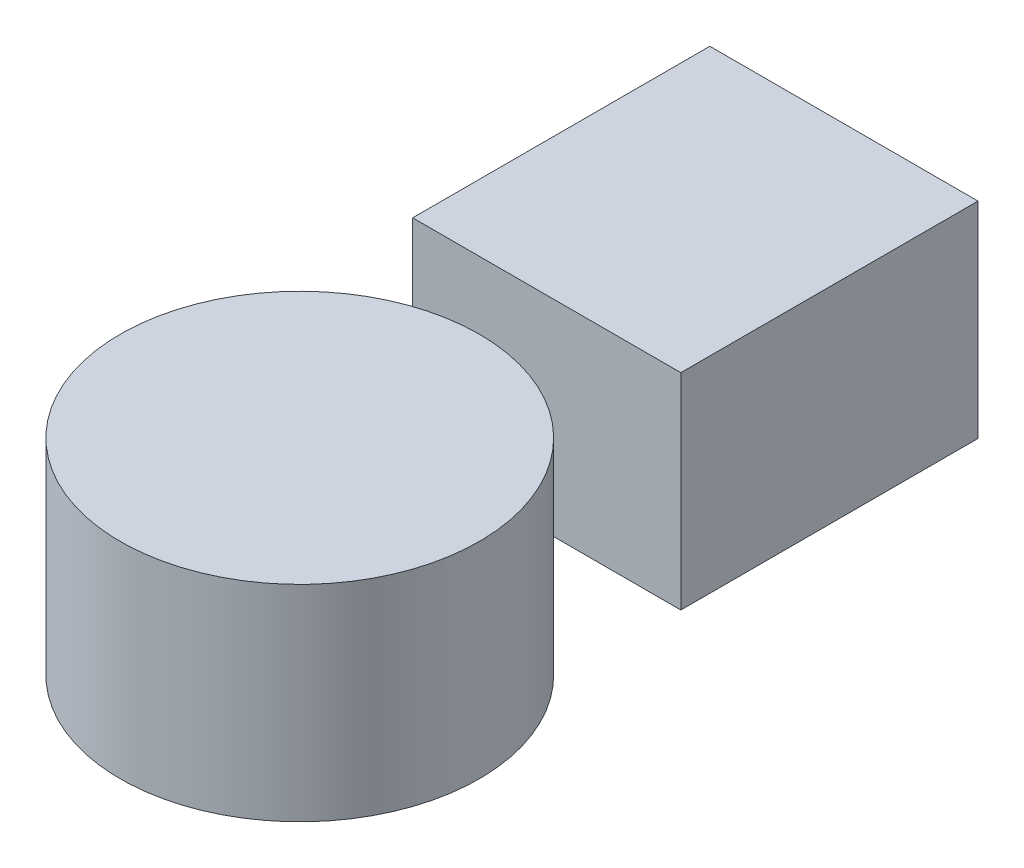
ISO-10303-21;
HEADER;
FILE_DESCRIPTION(('STEP AP214'),'2;1');
FILE_NAME('part.step','',(''),(''),'','','');
FILE_SCHEMA(('AUTOMOTIVE_DESIGN { 1 0 10303 214 1 1 1 1 }'));
ENDSEC;
DATA;
#1=APPLICATION_CONTEXT('core data for automotive mechanical design processes');
#2=APPLICATION_PROTOCOL_DEFINITION('international standard','automotive_design',2000,#1);
#3=PRODUCT_CONTEXT('',#1,'mechanical');
#4=PRODUCT('Part','Part','',(#3));
#5=PRODUCT_RELATED_PRODUCT_CATEGORY('part','',(#4));
#6=PRODUCT_DEFINITION_FORMATION('','',#4);
#7=PRODUCT_DEFINITION_CONTEXT('part definition',#1,'design');
#8=PRODUCT_DEFINITION('design','',#6,#7);
#9=PRODUCT_DEFINITION_SHAPE('','',#8);
#10=(LENGTH_UNIT() NAMED_UNIT(*) SI_UNIT(.MILLI.,.METRE.));
#11=(NAMED_UNIT(*) PLANE_ANGLE_UNIT() SI_UNIT($,.RADIAN.));
#12=(NAMED_UNIT(*) SI_UNIT($,.STERADIAN.) SOLID_ANGLE_UNIT());
#13=UNCERTAINTY_MEASURE_WITH_UNIT(LENGTH_MEASURE(1.E-05),#10,'distance_accuracy_value','');
#14=(GEOMETRIC_REPRESENTATION_CONTEXT(3) GLOBAL_UNCERTAINTY_ASSIGNED_CONTEXT((#13)) GLOBAL_UNIT_ASSIGNED_CONTEXT((#10,
#11,#12)) REPRESENTATION_CONTEXT('',''));
#15=CARTESIAN_POINT('',(0.,0.,0.));
#16=DIRECTION('',(0.,0.,1.));
#17=DIRECTION('',(1.,0.,0.));
#18=AXIS2_PLACEMENT_3D('',#15,#16,#17);
#19=CARTESIAN_POINT('',(-43.830339722009,198.053018744922,-177.866757769681));
#20=DIRECTION('',(1.,0.,0.));
#21=DIRECTION('',(0.,0.,-1.));
#22=AXIS2_PLACEMENT_3D('',#19,#20,#21);
#23=PLANE('',#22);
#24=DIRECTION('',(0.,0.,1.));
#25=VECTOR('',#24,1.);
#26=CARTESIAN_POINT('',(-43.830339722009,67.2092550326107,-177.866757769681));
#27=LINE('',#26,#25);
#28=CARTESIAN_POINT('',(-43.830339722009,67.2092550326107,-177.866757769681));
#29=VERTEX_POINT('',#28);
#30=CARTESIAN_POINT('',(-43.830339722009,67.2092550326107,-80.7292481154995));
#31=VERTEX_POINT('',#30);
#32=EDGE_CURVE('E94',#29,#31,#27,.T.);
#33=ORIENTED_EDGE('',*,*,#32,.F.);
#34=DIRECTION('',(0.,-1.,0.));
#35=VECTOR('',#34,1.);
#36=CARTESIAN_POINT('',(-43.830339722009,198.053018744922,-177.866757769681));
#37=LINE('',#36,#35);
#38=CARTESIAN_POINT('',(-43.830339722009,0.,-177.866757769681));
#39=VERTEX_POINT('',#38);
#40=EDGE_CURVE('E48',#29,#39,#37,.T.);
#41=ORIENTED_EDGE('',*,*,#40,.T.);
#42=DIRECTION('',(0.,0.,1.));
#43=VECTOR('',#42,1.);
#44=CARTESIAN_POINT('',(-43.830339722009,0.,-177.866757769681));
#45=LINE('',#44,#43);
#46=CARTESIAN_POINT('',(-43.830339722009,0.,-80.7292481154995));
#47=VERTEX_POINT('',#46);
#48=EDGE_CURVE('E92',#39,#47,#45,.T.);
#49=ORIENTED_EDGE('',*,*,#48,.T.);
#50=DIRECTION('',(0.,-1.,0.));
#51=VECTOR('',#50,1.);
#52=CARTESIAN_POINT('',(-43.830339722009,198.053018744922,-80.7292481154995));
#53=LINE('',#52,#51);
#54=EDGE_CURVE('E83',#31,#47,#53,.T.);
#55=ORIENTED_EDGE('',*,*,#54,.F.);
#56=EDGE_LOOP('',(#33,#41,#49,#55));
#57=FACE_BOUND('',#56,.T.);
#58=ADVANCED_FACE('F44',(#57),#23,.F.);
#59=CARTESIAN_POINT('',(-43.830339722009,198.053018744922,-80.7292481154995));
#60=DIRECTION('',(0.,0.,-1.));
#61=DIRECTION('',(-1.,0.,0.));
#62=AXIS2_PLACEMENT_3D('',#59,#60,#61);
#63=PLANE('',#62);
#64=DIRECTION('',(1.,0.,0.));
#65=VECTOR('',#64,1.);
#66=CARTESIAN_POINT('',(-43.830339722009,67.2092550326107,-80.7292481154995));
#67=LINE('',#66,#65);
#68=CARTESIAN_POINT('',(43.830339722009,67.2092550326107,-80.7292481154995));
#69=VERTEX_POINT('',#68);
#70=EDGE_CURVE('E53',#31,#69,#67,.T.);
#71=ORIENTED_EDGE('',*,*,#70,.F.);
#72=ORIENTED_EDGE('',*,*,#54,.T.);
#73=DIRECTION('',(1.,0.,0.));
#74=VECTOR('',#73,1.);
#75=CARTESIAN_POINT('',(-43.830339722009,0.,-80.7292481154995));
#76=LINE('',#75,#74);
#77=CARTESIAN_POINT('',(43.830339722009,0.,-80.7292481154995));
#78=VERTEX_POINT('',#77);
#79=EDGE_CURVE('E104',#47,#78,#76,.T.);
#80=ORIENTED_EDGE('',*,*,#79,.T.);
#81=DIRECTION('',(0.,-1.,0.));
#82=VECTOR('',#81,1.);
#83=CARTESIAN_POINT('',(43.830339722009,198.053018744922,-80.7292481154995));
#84=LINE('',#83,#82);
#85=EDGE_CURVE('E113',#69,#78,#84,.T.);
#86=ORIENTED_EDGE('',*,*,#85,.F.);
#87=EDGE_LOOP('',(#71,#72,#80,#86));
#88=FACE_BOUND('',#87,.T.);
#89=ADVANCED_FACE('F117',(#88),#63,.F.);
#90=CARTESIAN_POINT('',(43.830339722009,198.053018744922,-177.866757769681));
#91=DIRECTION('',(-1.,0.,0.));
#92=DIRECTION('',(0.,0.,1.));
#93=AXIS2_PLACEMENT_3D('',#90,#91,#92);
#94=PLANE('',#93);
#95=DIRECTION('',(0.,0.,-1.));
#96=VECTOR('',#95,1.);
#97=CARTESIAN_POINT('',(43.830339722009,67.2092550326107,-177.866757769681));
#98=LINE('',#97,#96);
#99=CARTESIAN_POINT('',(43.830339722009,67.2092550326107,-177.866757769681));
#100=VERTEX_POINT('',#99);
#101=EDGE_CURVE('E12',#69,#100,#98,.T.);
#102=ORIENTED_EDGE('',*,*,#101,.F.);
#103=ORIENTED_EDGE('',*,*,#85,.T.);
#104=DIRECTION('',(0.,0.,-1.));
#105=VECTOR('',#104,1.);
#106=CARTESIAN_POINT('',(43.830339722009,0.,-177.866757769681));
#107=LINE('',#106,#105);
#108=CARTESIAN_POINT('',(43.830339722009,0.,-177.866757769681));
#109=VERTEX_POINT('',#108);
#110=EDGE_CURVE('E114',#78,#109,#107,.T.);
#111=ORIENTED_EDGE('',*,*,#110,.T.);
#112=DIRECTION('',(0.,-1.,0.));
#113=VECTOR('',#112,1.);
#114=CARTESIAN_POINT('',(43.830339722009,198.053018744922,-177.866757769681));
#115=LINE('',#114,#113);
#116=EDGE_CURVE('E66',#100,#109,#115,.T.);
#117=ORIENTED_EDGE('',*,*,#116,.F.);
#118=EDGE_LOOP('',(#102,#103,#111,#117));
#119=FACE_BOUND('',#118,.T.);
#120=ADVANCED_FACE('F116',(#119),#94,.F.);
#121=CARTESIAN_POINT('',(-43.830339722009,198.053018744922,-177.866757769681));
#122=DIRECTION('',(0.,0.,1.));
#123=DIRECTION('',(1.,0.,0.));
#124=AXIS2_PLACEMENT_3D('',#121,#122,#123);
#125=PLANE('',#124);
#126=DIRECTION('',(-1.,0.,0.));
#127=VECTOR('',#126,1.);
#128=CARTESIAN_POINT('',(-43.830339722009,67.2092550326107,-177.866757769681));
#129=LINE('',#128,#127);
#130=EDGE_CURVE('E101',#100,#29,#129,.T.);
#131=ORIENTED_EDGE('',*,*,#130,.F.);
#132=ORIENTED_EDGE('',*,*,#116,.T.);
#133=DIRECTION('',(-1.,0.,0.));
#134=VECTOR('',#133,1.);
#135=CARTESIAN_POINT('',(-43.830339722009,0.,-177.866757769681));
#136=LINE('',#135,#134);
#137=EDGE_CURVE('E97',#109,#39,#136,.T.);
#138=ORIENTED_EDGE('',*,*,#137,.T.);
#139=ORIENTED_EDGE('',*,*,#40,.F.);
#140=EDGE_LOOP('',(#131,#132,#138,#139));
#141=FACE_BOUND('',#140,.T.);
#142=ADVANCED_FACE('F98',(#141),#125,.F.);
#143=CARTESIAN_POINT('',(0.,0.,0.));
#144=DIRECTION('',(0.,1.,0.));
#145=DIRECTION('',(0.,0.,1.));
#146=AXIS2_PLACEMENT_3D('',#143,#144,#145);
#147=PLANE('',#146);
#148=ORIENTED_EDGE('',*,*,#48,.F.);
#149=ORIENTED_EDGE('',*,*,#137,.F.);
#150=ORIENTED_EDGE('',*,*,#110,.F.);
#151=ORIENTED_EDGE('',*,*,#79,.F.);
#152=EDGE_LOOP('',(#148,#149,#150,#151));
#153=FACE_BOUND('',#152,.T.);
#154=ADVANCED_FACE('F103',(#153),#147,.F.);
#155=CARTESIAN_POINT('',(0.,67.2092550326107,0.));
#156=DIRECTION('',(0.,1.,0.));
#157=DIRECTION('',(0.,0.,1.));
#158=AXIS2_PLACEMENT_3D('',#155,#156,#157);
#159=PLANE('',#158);
#160=ORIENTED_EDGE('',*,*,#130,.T.);
#161=ORIENTED_EDGE('',*,*,#32,.T.);
#162=ORIENTED_EDGE('',*,*,#70,.T.);
#163=ORIENTED_EDGE('',*,*,#101,.T.);
#164=EDGE_LOOP('',(#160,#161,#162,#163));
#165=FACE_BOUND('',#164,.T.);
#166=ADVANCED_FACE('F46',(#165),#159,.T.);
#167=CLOSED_SHELL('',(#58,#89,#120,#142,#154,#166));
#168=MANIFOLD_SOLID_BREP('B2',#167);
#169=CARTESIAN_POINT('',(0.,67.2092550326107,0.));
#170=DIRECTION('',(0.,1.,0.));
#171=DIRECTION('',(0.,0.,1.));
#172=AXIS2_PLACEMENT_3D('',#169,#170,#171);
#173=PLANE('',#172);
#174=CARTESIAN_POINT('',(0.,67.2092550326107,0.));
#175=DIRECTION('',(0.,-1.,0.));
#176=DIRECTION('',(0.,0.,-1.));
#177=AXIS2_PLACEMENT_3D('',#174,#175,#176);
#178=CIRCLE('',#177,58.6870440198301);
#179=CARTESIAN_POINT('',(0.,67.2092550326107,-58.6870440198301));
#180=VERTEX_POINT('',#179);
#181=EDGE_CURVE('E43',#180,#180,#178,.T.);
#182=ORIENTED_EDGE('',*,*,#181,.F.);
#183=EDGE_LOOP('',(#182));
#184=FACE_BOUND('',#183,.T.);
#185=ADVANCED_FACE('F167',(#184),#173,.T.);
#186=CARTESIAN_POINT('',(0.,0.,0.));
#187=DIRECTION('',(0.,-1.,0.));
#188=DIRECTION('',(0.,0.,-1.));
#189=AXIS2_PLACEMENT_3D('',#186,#187,#188);
#190=CYLINDRICAL_SURFACE('',#189,58.6870440198301);
#191=ORIENTED_EDGE('',*,*,#181,.T.);
#192=EDGE_LOOP('',(#191));
#193=FACE_BOUND('',#192,.T.);
#194=CARTESIAN_POINT('',(0.,0.,0.));
#195=DIRECTION('',(0.,-1.,0.));
#196=DIRECTION('',(0.,0.,-1.));
#197=AXIS2_PLACEMENT_3D('',#194,#195,#196);
#198=CIRCLE('',#197,58.6870440198301);
#199=CARTESIAN_POINT('',(0.,0.,-58.6870440198301));
#200=VERTEX_POINT('',#199);
#201=EDGE_CURVE('E173',#200,#200,#198,.T.);
#202=ORIENTED_EDGE('',*,*,#201,.F.);
#203=EDGE_LOOP('',(#202));
#204=FACE_BOUND('',#203,.T.);
#205=ADVANCED_FACE('F181',(#193,#204),#190,.T.);
#206=CARTESIAN_POINT('',(0.,0.,0.));
#207=DIRECTION('',(0.,-1.,0.));
#208=DIRECTION('',(0.,0.,-1.));
#209=AXIS2_PLACEMENT_3D('',#206,#207,#208);
#210=PLANE('',#209);
#211=ORIENTED_EDGE('',*,*,#201,.T.);
#212=EDGE_LOOP('',(#211));
#213=FACE_BOUND('',#212,.T.);
#214=ADVANCED_FACE('F179',(#213),#210,.T.);
#215=CLOSED_SHELL('',(#185,#205,#214));
#216=MANIFOLD_SOLID_BREP('B6',#215);
#217=ADVANCED_BREP_SHAPE_REPRESENTATION('',(#18,#168,#216),#14);
#218=SHAPE_DEFINITION_REPRESENTATION(#9,#217);
ENDSEC;
END-ISO-10303-21;
